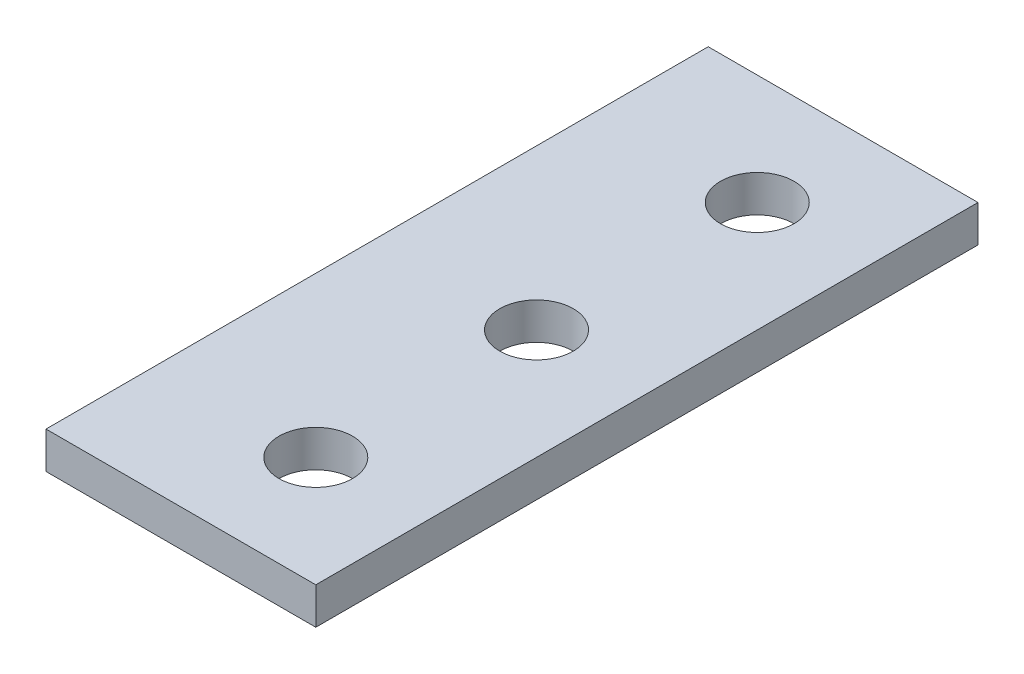
ISO-10303-21;
HEADER;
FILE_DESCRIPTION(('STEP AP214'),'2;1');
FILE_NAME('part.step','',(''),(''),'','','');
FILE_SCHEMA(('AUTOMOTIVE_DESIGN { 1 0 10303 214 1 1 1 1 }'));
ENDSEC;
DATA;
#1=APPLICATION_CONTEXT('core data for automotive mechanical design processes');
#2=APPLICATION_PROTOCOL_DEFINITION('international standard','automotive_design',2000,#1);
#3=PRODUCT_CONTEXT('',#1,'mechanical');
#4=PRODUCT('Part','Part','',(#3));
#5=PRODUCT_RELATED_PRODUCT_CATEGORY('part','',(#4));
#6=PRODUCT_DEFINITION_FORMATION('','',#4);
#7=PRODUCT_DEFINITION_CONTEXT('part definition',#1,'design');
#8=PRODUCT_DEFINITION('design','',#6,#7);
#9=PRODUCT_DEFINITION_SHAPE('','',#8);
#10=(LENGTH_UNIT() NAMED_UNIT(*) SI_UNIT(.MILLI.,.METRE.));
#11=(NAMED_UNIT(*) PLANE_ANGLE_UNIT() SI_UNIT($,.RADIAN.));
#12=(NAMED_UNIT(*) SI_UNIT($,.STERADIAN.) SOLID_ANGLE_UNIT());
#13=UNCERTAINTY_MEASURE_WITH_UNIT(LENGTH_MEASURE(1.E-05),#10,'distance_accuracy_value','');
#14=(GEOMETRIC_REPRESENTATION_CONTEXT(3) GLOBAL_UNCERTAINTY_ASSIGNED_CONTEXT((#13)) GLOBAL_UNIT_ASSIGNED_CONTEXT((#10,
#11,#12)) REPRESENTATION_CONTEXT('',''));
#15=CARTESIAN_POINT('',(0.,0.,0.));
#16=DIRECTION('',(0.,0.,1.));
#17=DIRECTION('',(1.,0.,0.));
#18=AXIS2_PLACEMENT_3D('',#15,#16,#17);
#19=CARTESIAN_POINT('',(0.,4.5,0.));
#20=DIRECTION('',(0.,1.,0.));
#21=DIRECTION('',(0.,0.,1.));
#22=AXIS2_PLACEMENT_3D('',#19,#20,#21);
#23=PLANE('',#22);
#24=CARTESIAN_POINT('',(39.,4.5,81.));
#25=DIRECTION('',(0.,1.,0.));
#26=DIRECTION('',(0.,0.,1.));
#27=AXIS2_PLACEMENT_3D('',#24,#25,#26);
#28=CIRCLE('',#27,9.00000000000001);
#29=CARTESIAN_POINT('',(39.,4.5,90.));
#30=VERTEX_POINT('',#29);
#31=EDGE_CURVE('E115',#30,#30,#28,.T.);
#32=ORIENTED_EDGE('',*,*,#31,.F.);
#33=EDGE_LOOP('',(#32));
#34=FACE_BOUND('',#33,.T.);
#35=DIRECTION('',(0.,0.,1.));
#36=VECTOR('',#35,1.);
#37=CARTESIAN_POINT('',(0.,4.5,0.));
#38=LINE('',#37,#36);
#39=CARTESIAN_POINT('',(0.,4.5,0.));
#40=VERTEX_POINT('',#39);
#41=CARTESIAN_POINT('',(0.,4.5,162.));
#42=VERTEX_POINT('',#41);
#43=EDGE_CURVE('E85',#40,#42,#38,.T.);
#44=ORIENTED_EDGE('',*,*,#43,.T.);
#45=DIRECTION('',(1.,0.,0.));
#46=VECTOR('',#45,1.);
#47=CARTESIAN_POINT('',(0.,4.5,162.));
#48=LINE('',#47,#46);
#49=CARTESIAN_POINT('',(66.0000000000001,4.5,162.));
#50=VERTEX_POINT('',#49);
#51=EDGE_CURVE('E80',#42,#50,#48,.T.);
#52=ORIENTED_EDGE('',*,*,#51,.T.);
#53=DIRECTION('',(0.,0.,-1.));
#54=VECTOR('',#53,1.);
#55=CARTESIAN_POINT('',(66.,4.5,0.));
#56=LINE('',#55,#54);
#57=CARTESIAN_POINT('',(66.,4.5,0.));
#58=VERTEX_POINT('',#57);
#59=EDGE_CURVE('E83',#50,#58,#56,.T.);
#60=ORIENTED_EDGE('',*,*,#59,.T.);
#61=DIRECTION('',(-1.,0.,0.));
#62=VECTOR('',#61,1.);
#63=CARTESIAN_POINT('',(0.,4.5,0.));
#64=LINE('',#63,#62);
#65=EDGE_CURVE('E50',#58,#40,#64,.T.);
#66=ORIENTED_EDGE('',*,*,#65,.T.);
#67=EDGE_LOOP('',(#44,#52,#60,#66));
#68=FACE_BOUND('',#67,.T.);
#69=CARTESIAN_POINT('',(39.,4.5,135.));
#70=DIRECTION('',(0.,1.,0.));
#71=DIRECTION('',(0.,0.,1.));
#72=AXIS2_PLACEMENT_3D('',#69,#70,#71);
#73=CIRCLE('',#72,9.00000000000001);
#74=CARTESIAN_POINT('',(39.,4.5,144.));
#75=VERTEX_POINT('',#74);
#76=EDGE_CURVE('E100',#75,#75,#73,.T.);
#77=ORIENTED_EDGE('',*,*,#76,.F.);
#78=EDGE_LOOP('',(#77));
#79=FACE_BOUND('',#78,.T.);
#80=CARTESIAN_POINT('',(39.,4.5,27.));
#81=DIRECTION('',(0.,1.,0.));
#82=DIRECTION('',(0.,0.,1.));
#83=AXIS2_PLACEMENT_3D('',#80,#81,#82);
#84=CIRCLE('',#83,9.);
#85=CARTESIAN_POINT('',(39.,4.5,36.));
#86=VERTEX_POINT('',#85);
#87=EDGE_CURVE('E121',#86,#86,#84,.T.);
#88=ORIENTED_EDGE('',*,*,#87,.F.);
#89=EDGE_LOOP('',(#88));
#90=FACE_BOUND('',#89,.T.);
#91=ADVANCED_FACE('F33',(#34,#68,#79,#90),#23,.T.);
#92=CARTESIAN_POINT('',(0.,-4.5,0.));
#93=DIRECTION('',(0.,1.,0.));
#94=DIRECTION('',(0.,0.,1.));
#95=AXIS2_PLACEMENT_3D('',#92,#93,#94);
#96=PLANE('',#95);
#97=DIRECTION('',(0.,0.,1.));
#98=VECTOR('',#97,1.);
#99=CARTESIAN_POINT('',(0.,-4.5,0.));
#100=LINE('',#99,#98);
#101=CARTESIAN_POINT('',(0.,-4.5,0.));
#102=VERTEX_POINT('',#101);
#103=CARTESIAN_POINT('',(0.,-4.5,162.));
#104=VERTEX_POINT('',#103);
#105=EDGE_CURVE('E97',#102,#104,#100,.T.);
#106=ORIENTED_EDGE('',*,*,#105,.F.);
#107=DIRECTION('',(-1.,0.,0.));
#108=VECTOR('',#107,1.);
#109=CARTESIAN_POINT('',(0.,-4.5,0.));
#110=LINE('',#109,#108);
#111=CARTESIAN_POINT('',(66.,-4.5,0.));
#112=VERTEX_POINT('',#111);
#113=EDGE_CURVE('E73',#112,#102,#110,.T.);
#114=ORIENTED_EDGE('',*,*,#113,.F.);
#115=DIRECTION('',(0.,0.,-1.));
#116=VECTOR('',#115,1.);
#117=CARTESIAN_POINT('',(66.,-4.5,0.));
#118=LINE('',#117,#116);
#119=CARTESIAN_POINT('',(66.0000000000001,-4.5,162.));
#120=VERTEX_POINT('',#119);
#121=EDGE_CURVE('E67',#120,#112,#118,.T.);
#122=ORIENTED_EDGE('',*,*,#121,.F.);
#123=DIRECTION('',(1.,0.,0.));
#124=VECTOR('',#123,1.);
#125=CARTESIAN_POINT('',(0.,-4.5,162.));
#126=LINE('',#125,#124);
#127=EDGE_CURVE('E89',#104,#120,#126,.T.);
#128=ORIENTED_EDGE('',*,*,#127,.F.);
#129=EDGE_LOOP('',(#106,#114,#122,#128));
#130=FACE_BOUND('',#129,.T.);
#131=CARTESIAN_POINT('',(39.,-4.5,135.));
#132=DIRECTION('',(0.,1.,0.));
#133=DIRECTION('',(0.,0.,1.));
#134=AXIS2_PLACEMENT_3D('',#131,#132,#133);
#135=CIRCLE('',#134,9.00000000000001);
#136=CARTESIAN_POINT('',(39.,-4.5,144.));
#137=VERTEX_POINT('',#136);
#138=EDGE_CURVE('E112',#137,#137,#135,.T.);
#139=ORIENTED_EDGE('',*,*,#138,.T.);
#140=EDGE_LOOP('',(#139));
#141=FACE_BOUND('',#140,.T.);
#142=CARTESIAN_POINT('',(39.,-4.5,81.));
#143=DIRECTION('',(0.,1.,0.));
#144=DIRECTION('',(0.,0.,1.));
#145=AXIS2_PLACEMENT_3D('',#142,#143,#144);
#146=CIRCLE('',#145,9.00000000000001);
#147=CARTESIAN_POINT('',(39.,-4.5,90.));
#148=VERTEX_POINT('',#147);
#149=EDGE_CURVE('E118',#148,#148,#146,.T.);
#150=ORIENTED_EDGE('',*,*,#149,.T.);
#151=EDGE_LOOP('',(#150));
#152=FACE_BOUND('',#151,.T.);
#153=CARTESIAN_POINT('',(39.,-4.5,27.));
#154=DIRECTION('',(0.,1.,0.));
#155=DIRECTION('',(0.,0.,1.));
#156=AXIS2_PLACEMENT_3D('',#153,#154,#155);
#157=CIRCLE('',#156,9.);
#158=CARTESIAN_POINT('',(39.,-4.5,36.));
#159=VERTEX_POINT('',#158);
#160=EDGE_CURVE('E124',#159,#159,#157,.T.);
#161=ORIENTED_EDGE('',*,*,#160,.T.);
#162=EDGE_LOOP('',(#161));
#163=FACE_BOUND('',#162,.T.);
#164=ADVANCED_FACE('F108',(#130,#141,#152,#163),#96,.F.);
#165=CARTESIAN_POINT('',(0.,4.5,0.));
#166=DIRECTION('',(1.,0.,0.));
#167=DIRECTION('',(0.,0.,-1.));
#168=AXIS2_PLACEMENT_3D('',#165,#166,#167);
#169=PLANE('',#168);
#170=ORIENTED_EDGE('',*,*,#105,.T.);
#171=DIRECTION('',(0.,-1.,0.));
#172=VECTOR('',#171,1.);
#173=CARTESIAN_POINT('',(0.,4.5,162.));
#174=LINE('',#173,#172);
#175=EDGE_CURVE('E11',#42,#104,#174,.T.);
#176=ORIENTED_EDGE('',*,*,#175,.F.);
#177=ORIENTED_EDGE('',*,*,#43,.F.);
#178=DIRECTION('',(0.,-1.,0.));
#179=VECTOR('',#178,1.);
#180=CARTESIAN_POINT('',(0.,4.5,0.));
#181=LINE('',#180,#179);
#182=EDGE_CURVE('E93',#40,#102,#181,.T.);
#183=ORIENTED_EDGE('',*,*,#182,.T.);
#184=EDGE_LOOP('',(#170,#176,#177,#183));
#185=FACE_BOUND('',#184,.T.);
#186=ADVANCED_FACE('F35',(#185),#169,.F.);
#187=CARTESIAN_POINT('',(0.,4.5,162.));
#188=DIRECTION('',(0.,0.,-1.));
#189=DIRECTION('',(-1.,0.,0.));
#190=AXIS2_PLACEMENT_3D('',#187,#188,#189);
#191=PLANE('',#190);
#192=ORIENTED_EDGE('',*,*,#127,.T.);
#193=DIRECTION('',(0.,-1.,0.));
#194=VECTOR('',#193,1.);
#195=CARTESIAN_POINT('',(66.0000000000001,4.5,162.));
#196=LINE('',#195,#194);
#197=EDGE_CURVE('E42',#50,#120,#196,.T.);
#198=ORIENTED_EDGE('',*,*,#197,.F.);
#199=ORIENTED_EDGE('',*,*,#51,.F.);
#200=ORIENTED_EDGE('',*,*,#175,.T.);
#201=EDGE_LOOP('',(#192,#198,#199,#200));
#202=FACE_BOUND('',#201,.T.);
#203=ADVANCED_FACE('F88',(#202),#191,.F.);
#204=CARTESIAN_POINT('',(66.,4.5,0.));
#205=DIRECTION('',(-1.,0.,0.));
#206=DIRECTION('',(0.,0.,1.));
#207=AXIS2_PLACEMENT_3D('',#204,#205,#206);
#208=PLANE('',#207);
#209=ORIENTED_EDGE('',*,*,#121,.T.);
#210=DIRECTION('',(0.,-1.,0.));
#211=VECTOR('',#210,1.);
#212=CARTESIAN_POINT('',(66.,4.5,0.));
#213=LINE('',#212,#211);
#214=EDGE_CURVE('E90',#58,#112,#213,.T.);
#215=ORIENTED_EDGE('',*,*,#214,.F.);
#216=ORIENTED_EDGE('',*,*,#59,.F.);
#217=ORIENTED_EDGE('',*,*,#197,.T.);
#218=EDGE_LOOP('',(#209,#215,#216,#217));
#219=FACE_BOUND('',#218,.T.);
#220=ADVANCED_FACE('F91',(#219),#208,.F.);
#221=CARTESIAN_POINT('',(0.,4.5,0.));
#222=DIRECTION('',(0.,0.,1.));
#223=DIRECTION('',(1.,0.,0.));
#224=AXIS2_PLACEMENT_3D('',#221,#222,#223);
#225=PLANE('',#224);
#226=ORIENTED_EDGE('',*,*,#113,.T.);
#227=ORIENTED_EDGE('',*,*,#182,.F.);
#228=ORIENTED_EDGE('',*,*,#65,.F.);
#229=ORIENTED_EDGE('',*,*,#214,.T.);
#230=EDGE_LOOP('',(#226,#227,#228,#229));
#231=FACE_BOUND('',#230,.T.);
#232=ADVANCED_FACE('F105',(#231),#225,.F.);
#233=CARTESIAN_POINT('',(39.,4.5,135.));
#234=DIRECTION('',(0.,-1.,0.));
#235=DIRECTION('',(0.,0.,-1.));
#236=AXIS2_PLACEMENT_3D('',#233,#234,#235);
#237=CYLINDRICAL_SURFACE('',#236,9.00000000000001);
#238=ORIENTED_EDGE('',*,*,#76,.T.);
#239=EDGE_LOOP('',(#238));
#240=FACE_BOUND('',#239,.T.);
#241=ORIENTED_EDGE('',*,*,#138,.F.);
#242=EDGE_LOOP('',(#241));
#243=FACE_BOUND('',#242,.T.);
#244=ADVANCED_FACE('F142',(#240,#243),#237,.F.);
#245=CARTESIAN_POINT('',(39.,4.5,81.));
#246=DIRECTION('',(0.,-1.,0.));
#247=DIRECTION('',(0.,0.,-1.));
#248=AXIS2_PLACEMENT_3D('',#245,#246,#247);
#249=CYLINDRICAL_SURFACE('',#248,9.00000000000001);
#250=ORIENTED_EDGE('',*,*,#31,.T.);
#251=EDGE_LOOP('',(#250));
#252=FACE_BOUND('',#251,.T.);
#253=ORIENTED_EDGE('',*,*,#149,.F.);
#254=EDGE_LOOP('',(#253));
#255=FACE_BOUND('',#254,.T.);
#256=ADVANCED_FACE('F188',(#252,#255),#249,.F.);
#257=CARTESIAN_POINT('',(39.,4.5,27.));
#258=DIRECTION('',(0.,-1.,0.));
#259=DIRECTION('',(0.,0.,-1.));
#260=AXIS2_PLACEMENT_3D('',#257,#258,#259);
#261=CYLINDRICAL_SURFACE('',#260,9.);
#262=ORIENTED_EDGE('',*,*,#87,.T.);
#263=EDGE_LOOP('',(#262));
#264=FACE_BOUND('',#263,.T.);
#265=ORIENTED_EDGE('',*,*,#160,.F.);
#266=EDGE_LOOP('',(#265));
#267=FACE_BOUND('',#266,.T.);
#268=ADVANCED_FACE('F130',(#264,#267),#261,.F.);
#269=CLOSED_SHELL('',(#91,#164,#186,#203,#220,#232,#244,#256,#268));
#270=MANIFOLD_SOLID_BREP('B2',#269);
#271=ADVANCED_BREP_SHAPE_REPRESENTATION('',(#18,#270),#14);
#272=SHAPE_DEFINITION_REPRESENTATION(#9,#271);
ENDSEC;
END-ISO-10303-21;
